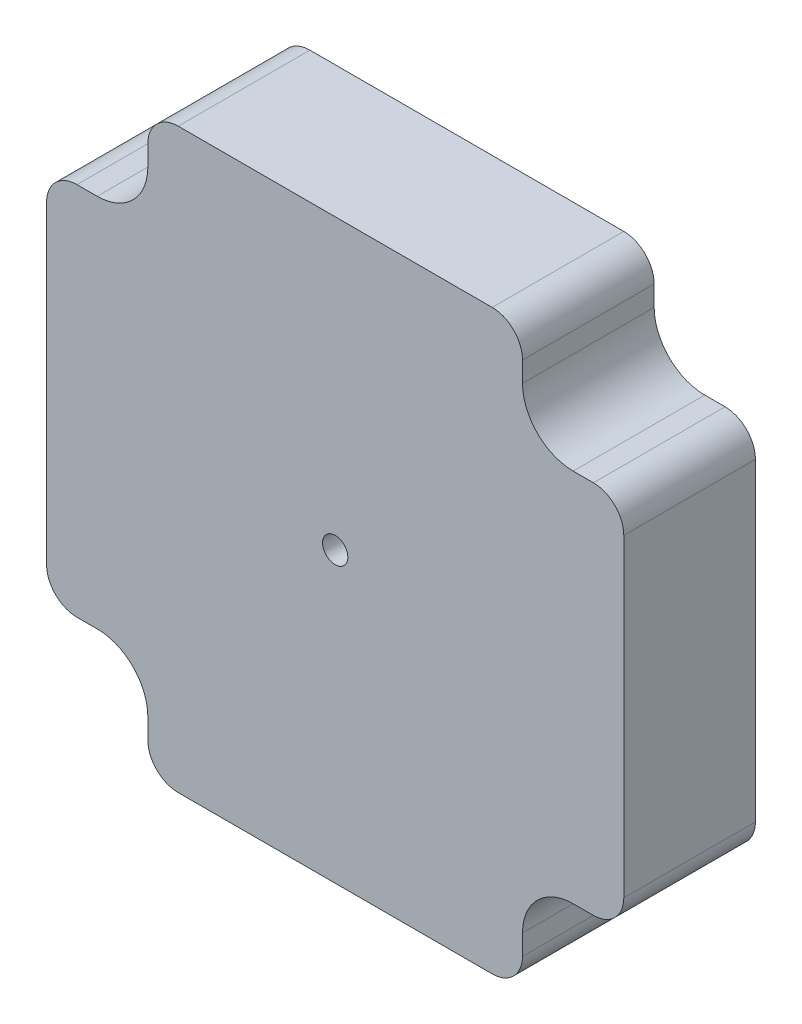
ISO-10303-21;
HEADER;
FILE_DESCRIPTION(('STEP AP214'),'2;1');
FILE_NAME('part.step','',(''),(''),'','','');
FILE_SCHEMA(('AUTOMOTIVE_DESIGN { 1 0 10303 214 1 1 1 1 }'));
ENDSEC;
DATA;
#1=APPLICATION_CONTEXT('core data for automotive mechanical design processes');
#2=APPLICATION_PROTOCOL_DEFINITION('international standard','automotive_design',2000,#1);
#3=PRODUCT_CONTEXT('',#1,'mechanical');
#4=PRODUCT('Part','Part','',(#3));
#5=PRODUCT_RELATED_PRODUCT_CATEGORY('part','',(#4));
#6=PRODUCT_DEFINITION_FORMATION('','',#4);
#7=PRODUCT_DEFINITION_CONTEXT('part definition',#1,'design');
#8=PRODUCT_DEFINITION('design','',#6,#7);
#9=PRODUCT_DEFINITION_SHAPE('','',#8);
#10=(LENGTH_UNIT() NAMED_UNIT(*) SI_UNIT(.MILLI.,.METRE.));
#11=(NAMED_UNIT(*) PLANE_ANGLE_UNIT() SI_UNIT($,.RADIAN.));
#12=(NAMED_UNIT(*) SI_UNIT($,.STERADIAN.) SOLID_ANGLE_UNIT());
#13=UNCERTAINTY_MEASURE_WITH_UNIT(LENGTH_MEASURE(1.E-05),#10,'distance_accuracy_value','');
#14=(GEOMETRIC_REPRESENTATION_CONTEXT(3) GLOBAL_UNCERTAINTY_ASSIGNED_CONTEXT((#13)) GLOBAL_UNIT_ASSIGNED_CONTEXT((#10,
#11,#12)) REPRESENTATION_CONTEXT('',''));
#15=CARTESIAN_POINT('',(0.,0.,0.));
#16=DIRECTION('',(0.,0.,1.));
#17=DIRECTION('',(1.,0.,0.));
#18=AXIS2_PLACEMENT_3D('',#15,#16,#17);
#19=CARTESIAN_POINT('',(-15.348869153361,-1.196280991736,-59.4999875));
#20=DIRECTION('',(0.,0.,-1.));
#21=DIRECTION('',(0.,1.,0.));
#22=AXIS2_PLACEMENT_3D('',#19,#20,#21);
#23=PLANE('',#22);
#24=CARTESIAN_POINT('',(8.151130846639,22.303719008264,-59.4999875));
#25=DIRECTION('',(0.,0.,1.));
#26=DIRECTION('',(0.,-1.,0.));
#27=AXIS2_PLACEMENT_3D('',#24,#25,#26);
#28=CIRCLE('',#27,1.25);
#29=CARTESIAN_POINT('',(8.151130846639,21.053719008264,-59.4999875));
#30=VERTEX_POINT('',#29);
#31=EDGE_CURVE('E359',#30,#30,#28,.T.);
#32=ORIENTED_EDGE('',*,*,#31,.T.);
#33=EDGE_LOOP('',(#32));
#34=FACE_BOUND('',#33,.T.);
#35=CARTESIAN_POINT('',(-7.348869153361,-3.196280991736,-59.4999875));
#36=DIRECTION('',(0.,0.,1.));
#37=DIRECTION('',(0.,1.,0.));
#38=AXIS2_PLACEMENT_3D('',#35,#36,#37);
#39=CIRCLE('',#38,3.);
#40=CARTESIAN_POINT('',(-10.348869153361,-3.196280991736,-59.4999875));
#41=VERTEX_POINT('',#40);
#42=CARTESIAN_POINT('',(-7.348869153361,-6.196280991736,-59.4999875));
#43=VERTEX_POINT('',#42);
#44=EDGE_CURVE('E318',#41,#43,#39,.T.);
#45=ORIENTED_EDGE('',*,*,#44,.F.);
#46=DIRECTION('',(0.,1.,0.));
#47=VECTOR('',#46,1.);
#48=CARTESIAN_POINT('',(-10.348869153361,-1.196280991736,-59.4999875));
#49=LINE('',#48,#47);
#50=CARTESIAN_POINT('',(-10.348869153361,-1.196280991736,-59.4999875));
#51=VERTEX_POINT('',#50);
#52=EDGE_CURVE('E315',#41,#51,#49,.T.);
#53=ORIENTED_EDGE('',*,*,#52,.T.);
#54=CARTESIAN_POINT('',(-15.348869153361,-1.196280991736,-59.4999875));
#55=DIRECTION('',(0.,0.,1.));
#56=DIRECTION('',(0.,1.,0.));
#57=AXIS2_PLACEMENT_3D('',#54,#55,#56);
#58=CIRCLE('',#57,5.);
#59=CARTESIAN_POINT('',(-15.348869153361,3.803719008264,-59.4999875));
#60=VERTEX_POINT('',#59);
#61=EDGE_CURVE('E459',#51,#60,#58,.T.);
#62=ORIENTED_EDGE('',*,*,#61,.T.);
#63=DIRECTION('',(-1.,0.,0.));
#64=VECTOR('',#63,1.);
#65=CARTESIAN_POINT('',(-17.348869153361,3.803719008264,-59.4999875));
#66=LINE('',#65,#64);
#67=CARTESIAN_POINT('',(-17.348869153361,3.803719008264,-59.4999875));
#68=VERTEX_POINT('',#67);
#69=EDGE_CURVE('E11',#60,#68,#66,.T.);
#70=ORIENTED_EDGE('',*,*,#69,.T.);
#71=CARTESIAN_POINT('',(-17.348869153361,6.803719008264,-59.4999875));
#72=DIRECTION('',(0.,0.,1.));
#73=DIRECTION('',(0.,1.,0.));
#74=AXIS2_PLACEMENT_3D('',#71,#72,#73);
#75=CIRCLE('',#74,3.);
#76=CARTESIAN_POINT('',(-20.348869153361,6.803719008264,-59.4999875));
#77=VERTEX_POINT('',#76);
#78=EDGE_CURVE('E339',#77,#68,#75,.T.);
#79=ORIENTED_EDGE('',*,*,#78,.F.);
#80=DIRECTION('',(0.,1.,0.));
#81=VECTOR('',#80,1.);
#82=CARTESIAN_POINT('',(-20.348869153361,37.803719008264,-59.4999875));
#83=LINE('',#82,#81);
#84=CARTESIAN_POINT('',(-20.348869153361,37.803719008264,-59.4999875));
#85=VERTEX_POINT('',#84);
#86=EDGE_CURVE('E340',#77,#85,#83,.T.);
#87=ORIENTED_EDGE('',*,*,#86,.T.);
#88=CARTESIAN_POINT('',(-17.348869153361,37.803719008264,-59.4999875));
#89=DIRECTION('',(0.,0.,1.));
#90=DIRECTION('',(0.,1.,0.));
#91=AXIS2_PLACEMENT_3D('',#88,#89,#90);
#92=CIRCLE('',#91,3.);
#93=CARTESIAN_POINT('',(-17.348869153361,40.803719008264,-59.4999875));
#94=VERTEX_POINT('',#93);
#95=EDGE_CURVE('E353',#94,#85,#92,.T.);
#96=ORIENTED_EDGE('',*,*,#95,.F.);
#97=DIRECTION('',(1.,0.,0.));
#98=VECTOR('',#97,1.);
#99=CARTESIAN_POINT('',(-15.348869153361,40.803719008264,-59.4999875));
#100=LINE('',#99,#98);
#101=CARTESIAN_POINT('',(-15.348869153361,40.803719008264,-59.4999875));
#102=VERTEX_POINT('',#101);
#103=EDGE_CURVE('E358',#94,#102,#100,.T.);
#104=ORIENTED_EDGE('',*,*,#103,.T.);
#105=CARTESIAN_POINT('',(-15.348869153361,45.803719008264,-59.4999875));
#106=DIRECTION('',(0.,0.,1.));
#107=DIRECTION('',(0.,1.,0.));
#108=AXIS2_PLACEMENT_3D('',#105,#106,#107);
#109=CIRCLE('',#108,5.);
#110=CARTESIAN_POINT('',(-10.348869153361,45.803719008264,-59.4999875));
#111=VERTEX_POINT('',#110);
#112=EDGE_CURVE('E400',#102,#111,#109,.T.);
#113=ORIENTED_EDGE('',*,*,#112,.T.);
#114=DIRECTION('',(0.,1.,0.));
#115=VECTOR('',#114,1.);
#116=CARTESIAN_POINT('',(-10.348869153361,47.803719008264,-59.4999875));
#117=LINE('',#116,#115);
#118=CARTESIAN_POINT('',(-10.348869153361,47.803719008264,-59.4999875));
#119=VERTEX_POINT('',#118);
#120=EDGE_CURVE('E371',#111,#119,#117,.T.);
#121=ORIENTED_EDGE('',*,*,#120,.T.);
#122=CARTESIAN_POINT('',(-7.348869153361,47.803719008264,-59.4999875));
#123=DIRECTION('',(0.,0.,1.));
#124=DIRECTION('',(0.,1.,0.));
#125=AXIS2_PLACEMENT_3D('',#122,#123,#124);
#126=CIRCLE('',#125,3.);
#127=CARTESIAN_POINT('',(-7.348869153361,50.803719008264,-59.4999875));
#128=VERTEX_POINT('',#127);
#129=EDGE_CURVE('E313',#128,#119,#126,.T.);
#130=ORIENTED_EDGE('',*,*,#129,.F.);
#131=DIRECTION('',(1.,0.,0.));
#132=VECTOR('',#131,1.);
#133=CARTESIAN_POINT('',(23.651130846639,50.803719008264,-59.4999875));
#134=LINE('',#133,#132);
#135=CARTESIAN_POINT('',(23.651130846639,50.803719008264,-59.4999875));
#136=VERTEX_POINT('',#135);
#137=EDGE_CURVE('E326',#128,#136,#134,.T.);
#138=ORIENTED_EDGE('',*,*,#137,.T.);
#139=CARTESIAN_POINT('',(23.651130846639,47.803719008264,-59.4999875));
#140=DIRECTION('',(0.,0.,1.));
#141=DIRECTION('',(0.,1.,0.));
#142=AXIS2_PLACEMENT_3D('',#139,#140,#141);
#143=CIRCLE('',#142,3.);
#144=CARTESIAN_POINT('',(26.651130846639,47.803719008264,-59.4999875));
#145=VERTEX_POINT('',#144);
#146=EDGE_CURVE('E305',#145,#136,#143,.T.);
#147=ORIENTED_EDGE('',*,*,#146,.F.);
#148=DIRECTION('',(0.,-1.,0.));
#149=VECTOR('',#148,1.);
#150=CARTESIAN_POINT('',(26.651130846639,45.803719008264,-59.4999875));
#151=LINE('',#150,#149);
#152=CARTESIAN_POINT('',(26.651130846639,45.803719008264,-59.4999875));
#153=VERTEX_POINT('',#152);
#154=EDGE_CURVE('E263',#145,#153,#151,.T.);
#155=ORIENTED_EDGE('',*,*,#154,.T.);
#156=CARTESIAN_POINT('',(31.651130846639,45.803719008264,-59.4999875));
#157=DIRECTION('',(0.,0.,1.));
#158=DIRECTION('',(0.,1.,0.));
#159=AXIS2_PLACEMENT_3D('',#156,#157,#158);
#160=CIRCLE('',#159,5.);
#161=CARTESIAN_POINT('',(31.651130846639,40.803719008264,-59.4999875));
#162=VERTEX_POINT('',#161);
#163=EDGE_CURVE('E268',#153,#162,#160,.T.);
#164=ORIENTED_EDGE('',*,*,#163,.T.);
#165=DIRECTION('',(1.,0.,0.));
#166=VECTOR('',#165,1.);
#167=CARTESIAN_POINT('',(33.651130846639,40.803719008264,-59.4999875));
#168=LINE('',#167,#166);
#169=CARTESIAN_POINT('',(33.651130846639,40.803719008264,-59.4999875));
#170=VERTEX_POINT('',#169);
#171=EDGE_CURVE('E269',#162,#170,#168,.T.);
#172=ORIENTED_EDGE('',*,*,#171,.T.);
#173=CARTESIAN_POINT('',(33.651130846639,37.803719008264,-59.4999875));
#174=DIRECTION('',(0.,0.,1.));
#175=DIRECTION('',(0.,1.,0.));
#176=AXIS2_PLACEMENT_3D('',#173,#174,#175);
#177=CIRCLE('',#176,3.);
#178=CARTESIAN_POINT('',(36.651130846639,37.803719008264,-59.4999875));
#179=VERTEX_POINT('',#178);
#180=EDGE_CURVE('E289',#179,#170,#177,.T.);
#181=ORIENTED_EDGE('',*,*,#180,.F.);
#182=DIRECTION('',(0.,-1.,0.));
#183=VECTOR('',#182,1.);
#184=CARTESIAN_POINT('',(36.651130846639,6.803719008264,-59.4999875));
#185=LINE('',#184,#183);
#186=CARTESIAN_POINT('',(36.651130846639,6.803719008264,-59.4999875));
#187=VERTEX_POINT('',#186);
#188=EDGE_CURVE('E349',#179,#187,#185,.T.);
#189=ORIENTED_EDGE('',*,*,#188,.T.);
#190=CARTESIAN_POINT('',(33.651130846639,6.803719008264,-59.4999875));
#191=DIRECTION('',(0.,0.,1.));
#192=DIRECTION('',(0.,1.,0.));
#193=AXIS2_PLACEMENT_3D('',#190,#191,#192);
#194=CIRCLE('',#193,3.);
#195=CARTESIAN_POINT('',(33.651130846639,3.803719008264,-59.4999875));
#196=VERTEX_POINT('',#195);
#197=EDGE_CURVE('E384',#196,#187,#194,.T.);
#198=ORIENTED_EDGE('',*,*,#197,.F.);
#199=DIRECTION('',(-1.,0.,0.));
#200=VECTOR('',#199,1.);
#201=CARTESIAN_POINT('',(31.651130846639,3.803719008264,-59.4999875));
#202=LINE('',#201,#200);
#203=CARTESIAN_POINT('',(31.651130846639,3.803719008264,-59.4999875));
#204=VERTEX_POINT('',#203);
#205=EDGE_CURVE('E292',#196,#204,#202,.T.);
#206=ORIENTED_EDGE('',*,*,#205,.T.);
#207=CARTESIAN_POINT('',(31.651130846639,-1.196280991736,-59.4999875));
#208=DIRECTION('',(0.,0.,1.));
#209=DIRECTION('',(0.,1.,0.));
#210=AXIS2_PLACEMENT_3D('',#207,#208,#209);
#211=CIRCLE('',#210,5.);
#212=CARTESIAN_POINT('',(26.651130846639,-1.196280991736,-59.4999875));
#213=VERTEX_POINT('',#212);
#214=EDGE_CURVE('E380',#204,#213,#211,.T.);
#215=ORIENTED_EDGE('',*,*,#214,.T.);
#216=DIRECTION('',(0.,-1.,0.));
#217=VECTOR('',#216,1.);
#218=CARTESIAN_POINT('',(26.651130846639,-3.196280991736,-59.4999875));
#219=LINE('',#218,#217);
#220=CARTESIAN_POINT('',(26.651130846639,-3.196280991736,-59.4999875));
#221=VERTEX_POINT('',#220);
#222=EDGE_CURVE('E306',#213,#221,#219,.T.);
#223=ORIENTED_EDGE('',*,*,#222,.T.);
#224=CARTESIAN_POINT('',(23.651130846639,-3.196280991736,-59.4999875));
#225=DIRECTION('',(0.,0.,1.));
#226=DIRECTION('',(0.,1.,0.));
#227=AXIS2_PLACEMENT_3D('',#224,#225,#226);
#228=CIRCLE('',#227,3.);
#229=CARTESIAN_POINT('',(23.651130846639,-6.196280991736,-59.4999875));
#230=VERTEX_POINT('',#229);
#231=EDGE_CURVE('E295',#230,#221,#228,.T.);
#232=ORIENTED_EDGE('',*,*,#231,.F.);
#233=DIRECTION('',(-1.,0.,0.));
#234=VECTOR('',#233,1.);
#235=CARTESIAN_POINT('',(-7.348869153361,-6.196280991736,-59.4999875));
#236=LINE('',#235,#234);
#237=EDGE_CURVE('E300',#230,#43,#236,.T.);
#238=ORIENTED_EDGE('',*,*,#237,.T.);
#239=EDGE_LOOP('',(#45,#53,#62,#70,#79,#87,#96,#104,#113,#121,#130,#138,#147,#155,#164,#172,
#181,#189,#198,#206,#215,#223,#232,#238));
#240=FACE_BOUND('',#239,.T.);
#241=ADVANCED_FACE('F16',(#34,#240),#23,.T.);
#242=CARTESIAN_POINT('',(-17.348869153361,3.803719008264,-46.4999875));
#243=DIRECTION('',(0.,1.,0.));
#244=DIRECTION('',(0.,0.,-1.));
#245=AXIS2_PLACEMENT_3D('',#242,#243,#244);
#246=PLANE('',#245);
#247=DIRECTION('',(0.,0.,1.));
#248=VECTOR('',#247,1.);
#249=CARTESIAN_POINT('',(-15.348869153361,3.803719008264,-46.4999875));
#250=LINE('',#249,#248);
#251=CARTESIAN_POINT('',(-15.348869153361,3.803719008264,-46.4999875));
#252=VERTEX_POINT('',#251);
#253=EDGE_CURVE('E468',#60,#252,#250,.T.);
#254=ORIENTED_EDGE('',*,*,#253,.T.);
#255=DIRECTION('',(-1.,0.,0.));
#256=VECTOR('',#255,1.);
#257=CARTESIAN_POINT('',(-15.348869153361,3.803719008264,-46.4999875));
#258=LINE('',#257,#256);
#259=CARTESIAN_POINT('',(-17.348869153361,3.803719008264,-46.4999875));
#260=VERTEX_POINT('',#259);
#261=EDGE_CURVE('E369',#252,#260,#258,.T.);
#262=ORIENTED_EDGE('',*,*,#261,.T.);
#263=DIRECTION('',(0.,0.,1.));
#264=VECTOR('',#263,1.);
#265=CARTESIAN_POINT('',(-17.348869153361,3.803719008264,-46.4999875));
#266=LINE('',#265,#264);
#267=EDGE_CURVE('E27',#68,#260,#266,.T.);
#268=ORIENTED_EDGE('',*,*,#267,.F.);
#269=ORIENTED_EDGE('',*,*,#69,.F.);
#270=EDGE_LOOP('',(#254,#262,#268,#269));
#271=FACE_BOUND('',#270,.T.);
#272=ADVANCED_FACE('F575',(#271),#246,.F.);
#273=CARTESIAN_POINT('',(-17.348869153361,6.803719008264,-46.4999875));
#274=DIRECTION('',(0.,0.,-1.));
#275=DIRECTION('',(0.,1.,0.));
#276=AXIS2_PLACEMENT_3D('',#273,#274,#275);
#277=CYLINDRICAL_SURFACE('',#276,3.);
#278=CARTESIAN_POINT('',(-17.348869153361,6.803719008264,-46.4999875));
#279=DIRECTION('',(0.,0.,-1.));
#280=DIRECTION('',(0.,1.,0.));
#281=AXIS2_PLACEMENT_3D('',#278,#279,#280);
#282=CIRCLE('',#281,3.);
#283=CARTESIAN_POINT('',(-20.348869153361,6.803719008264,-46.4999875));
#284=VERTEX_POINT('',#283);
#285=EDGE_CURVE('E365',#260,#284,#282,.T.);
#286=ORIENTED_EDGE('',*,*,#285,.T.);
#287=DIRECTION('',(0.,0.,-1.));
#288=VECTOR('',#287,1.);
#289=CARTESIAN_POINT('',(-20.348869153361,6.803719008264,-46.4999875));
#290=LINE('',#289,#288);
#291=EDGE_CURVE('E343',#284,#77,#290,.T.);
#292=ORIENTED_EDGE('',*,*,#291,.T.);
#293=ORIENTED_EDGE('',*,*,#78,.T.);
#294=ORIENTED_EDGE('',*,*,#267,.T.);
#295=EDGE_LOOP('',(#286,#292,#293,#294));
#296=FACE_BOUND('',#295,.T.);
#297=ADVANCED_FACE('F570',(#296),#277,.T.);
#298=CARTESIAN_POINT('',(-20.348869153361,37.803719008264,-46.4999875));
#299=DIRECTION('',(1.,0.,0.));
#300=DIRECTION('',(0.,1.,0.));
#301=AXIS2_PLACEMENT_3D('',#298,#299,#300);
#302=PLANE('',#301);
#303=ORIENTED_EDGE('',*,*,#291,.F.);
#304=DIRECTION('',(0.,1.,0.));
#305=VECTOR('',#304,1.);
#306=CARTESIAN_POINT('',(-20.348869153361,-1.196280991736,-46.4999875));
#307=LINE('',#306,#305);
#308=CARTESIAN_POINT('',(-20.348869153361,37.803719008264,-46.4999875));
#309=VERTEX_POINT('',#308);
#310=EDGE_CURVE('E370',#284,#309,#307,.T.);
#311=ORIENTED_EDGE('',*,*,#310,.T.);
#312=DIRECTION('',(0.,0.,1.));
#313=VECTOR('',#312,1.);
#314=CARTESIAN_POINT('',(-20.348869153361,37.803719008264,-46.4999875));
#315=LINE('',#314,#313);
#316=EDGE_CURVE('E357',#85,#309,#315,.T.);
#317=ORIENTED_EDGE('',*,*,#316,.F.);
#318=ORIENTED_EDGE('',*,*,#86,.F.);
#319=EDGE_LOOP('',(#303,#311,#317,#318));
#320=FACE_BOUND('',#319,.T.);
#321=ADVANCED_FACE('F18',(#320),#302,.F.);
#322=CARTESIAN_POINT('',(-17.348869153361,37.803719008264,-46.4999875));
#323=DIRECTION('',(0.,0.,-1.));
#324=DIRECTION('',(0.,1.,0.));
#325=AXIS2_PLACEMENT_3D('',#322,#323,#324);
#326=CYLINDRICAL_SURFACE('',#325,3.);
#327=CARTESIAN_POINT('',(-17.348869153361,37.803719008264,-46.4999875));
#328=DIRECTION('',(0.,0.,-1.));
#329=DIRECTION('',(0.,1.,0.));
#330=AXIS2_PLACEMENT_3D('',#327,#328,#329);
#331=CIRCLE('',#330,3.);
#332=CARTESIAN_POINT('',(-17.348869153361,40.803719008264,-46.4999875));
#333=VERTEX_POINT('',#332);
#334=EDGE_CURVE('E392',#309,#333,#331,.T.);
#335=ORIENTED_EDGE('',*,*,#334,.T.);
#336=DIRECTION('',(0.,0.,-1.));
#337=VECTOR('',#336,1.);
#338=CARTESIAN_POINT('',(-17.348869153361,40.803719008264,-46.4999875));
#339=LINE('',#338,#337);
#340=EDGE_CURVE('E427',#333,#94,#339,.T.);
#341=ORIENTED_EDGE('',*,*,#340,.T.);
#342=ORIENTED_EDGE('',*,*,#95,.T.);
#343=ORIENTED_EDGE('',*,*,#316,.T.);
#344=EDGE_LOOP('',(#335,#341,#342,#343));
#345=FACE_BOUND('',#344,.T.);
#346=ADVANCED_FACE('F604',(#345),#326,.T.);
#347=CARTESIAN_POINT('',(-15.348869153361,40.803719008264,-46.4999875));
#348=DIRECTION('',(0.,-1.,0.));
#349=DIRECTION('',(1.,0.,0.));
#350=AXIS2_PLACEMENT_3D('',#347,#348,#349);
#351=PLANE('',#350);
#352=ORIENTED_EDGE('',*,*,#340,.F.);
#353=DIRECTION('',(1.,0.,0.));
#354=VECTOR('',#353,1.);
#355=CARTESIAN_POINT('',(-15.348869153361,40.803719008264,-46.4999875));
#356=LINE('',#355,#354);
#357=CARTESIAN_POINT('',(-15.348869153361,40.803719008264,-46.4999875));
#358=VERTEX_POINT('',#357);
#359=EDGE_CURVE('E396',#333,#358,#356,.T.);
#360=ORIENTED_EDGE('',*,*,#359,.T.);
#361=DIRECTION('',(0.,0.,-1.));
#362=VECTOR('',#361,1.);
#363=CARTESIAN_POINT('',(-15.348869153361,40.803719008264,-46.4999875));
#364=LINE('',#363,#362);
#365=EDGE_CURVE('E375',#358,#102,#364,.T.);
#366=ORIENTED_EDGE('',*,*,#365,.T.);
#367=ORIENTED_EDGE('',*,*,#103,.F.);
#368=EDGE_LOOP('',(#352,#360,#366,#367));
#369=FACE_BOUND('',#368,.T.);
#370=ADVANCED_FACE('F591',(#369),#351,.F.);
#371=CARTESIAN_POINT('',(-15.348869153361,45.803719008264,-46.4999875));
#372=DIRECTION('',(0.,0.,-1.));
#373=DIRECTION('',(0.,1.,0.));
#374=AXIS2_PLACEMENT_3D('',#371,#372,#373);
#375=CYLINDRICAL_SURFACE('',#374,5.);
#376=ORIENTED_EDGE('',*,*,#365,.F.);
#377=CARTESIAN_POINT('',(-15.348869153361,45.803719008264,-46.4999875));
#378=DIRECTION('',(0.,0.,1.));
#379=DIRECTION('',(0.,1.,0.));
#380=AXIS2_PLACEMENT_3D('',#377,#378,#379);
#381=CIRCLE('',#380,5.);
#382=CARTESIAN_POINT('',(-10.348869153361,45.803719008264,-46.4999875));
#383=VERTEX_POINT('',#382);
#384=EDGE_CURVE('E20',#358,#383,#381,.T.);
#385=ORIENTED_EDGE('',*,*,#384,.T.);
#386=DIRECTION('',(0.,0.,-1.));
#387=VECTOR('',#386,1.);
#388=CARTESIAN_POINT('',(-10.348869153361,45.803719008264,-46.4999875));
#389=LINE('',#388,#387);
#390=EDGE_CURVE('E312',#383,#111,#389,.T.);
#391=ORIENTED_EDGE('',*,*,#390,.T.);
#392=ORIENTED_EDGE('',*,*,#112,.F.);
#393=EDGE_LOOP('',(#376,#385,#391,#392));
#394=FACE_BOUND('',#393,.T.);
#395=ADVANCED_FACE('F585',(#394),#375,.F.);
#396=CARTESIAN_POINT('',(-10.348869153361,47.803719008264,-46.4999875));
#397=DIRECTION('',(1.,0.,0.));
#398=DIRECTION('',(0.,0.,1.));
#399=AXIS2_PLACEMENT_3D('',#396,#397,#398);
#400=PLANE('',#399);
#401=ORIENTED_EDGE('',*,*,#390,.F.);
#402=DIRECTION('',(0.,1.,0.));
#403=VECTOR('',#402,1.);
#404=CARTESIAN_POINT('',(-10.348869153361,-1.196280991736,-46.4999875));
#405=LINE('',#404,#403);
#406=CARTESIAN_POINT('',(-10.348869153361,47.803719008264,-46.4999875));
#407=VERTEX_POINT('',#406);
#408=EDGE_CURVE('E344',#383,#407,#405,.T.);
#409=ORIENTED_EDGE('',*,*,#408,.T.);
#410=DIRECTION('',(0.,0.,1.));
#411=VECTOR('',#410,1.);
#412=CARTESIAN_POINT('',(-10.348869153361,47.803719008264,-46.4999875));
#413=LINE('',#412,#411);
#414=EDGE_CURVE('E310',#119,#407,#413,.T.);
#415=ORIENTED_EDGE('',*,*,#414,.F.);
#416=ORIENTED_EDGE('',*,*,#120,.F.);
#417=EDGE_LOOP('',(#401,#409,#415,#416));
#418=FACE_BOUND('',#417,.T.);
#419=ADVANCED_FACE('F590',(#418),#400,.F.);
#420=CARTESIAN_POINT('',(-7.348869153361,47.803719008264,-46.4999875));
#421=DIRECTION('',(0.,0.,-1.));
#422=DIRECTION('',(0.,1.,0.));
#423=AXIS2_PLACEMENT_3D('',#420,#421,#422);
#424=CYLINDRICAL_SURFACE('',#423,3.);
#425=CARTESIAN_POINT('',(-7.348869153361,47.803719008264,-46.4999875));
#426=DIRECTION('',(0.,0.,-1.));
#427=DIRECTION('',(0.,1.,0.));
#428=AXIS2_PLACEMENT_3D('',#425,#426,#427);
#429=CIRCLE('',#428,3.);
#430=CARTESIAN_POINT('',(-7.348869153361,50.803719008264,-46.4999875));
#431=VERTEX_POINT('',#430);
#432=EDGE_CURVE('E348',#407,#431,#429,.T.);
#433=ORIENTED_EDGE('',*,*,#432,.T.);
#434=DIRECTION('',(0.,0.,-1.));
#435=VECTOR('',#434,1.);
#436=CARTESIAN_POINT('',(-7.348869153361,50.803719008264,-46.4999875));
#437=LINE('',#436,#435);
#438=EDGE_CURVE('E304',#431,#128,#437,.T.);
#439=ORIENTED_EDGE('',*,*,#438,.T.);
#440=ORIENTED_EDGE('',*,*,#129,.T.);
#441=ORIENTED_EDGE('',*,*,#414,.T.);
#442=EDGE_LOOP('',(#433,#439,#440,#441));
#443=FACE_BOUND('',#442,.T.);
#444=ADVANCED_FACE('F530',(#443),#424,.T.);
#445=CARTESIAN_POINT('',(23.651130846639,50.803719008264,-46.4999875));
#446=DIRECTION('',(0.,-1.,0.));
#447=DIRECTION('',(1.,0.,0.));
#448=AXIS2_PLACEMENT_3D('',#445,#446,#447);
#449=PLANE('',#448);
#450=ORIENTED_EDGE('',*,*,#438,.F.);
#451=DIRECTION('',(1.,0.,0.));
#452=VECTOR('',#451,1.);
#453=CARTESIAN_POINT('',(-15.348869153361,50.803719008264,-46.4999875));
#454=LINE('',#453,#452);
#455=CARTESIAN_POINT('',(23.651130846639,50.803719008264,-46.4999875));
#456=VERTEX_POINT('',#455);
#457=EDGE_CURVE('E455',#431,#456,#454,.T.);
#458=ORIENTED_EDGE('',*,*,#457,.T.);
#459=DIRECTION('',(0.,0.,1.));
#460=VECTOR('',#459,1.);
#461=CARTESIAN_POINT('',(23.651130846639,50.803719008264,-46.4999875));
#462=LINE('',#461,#460);
#463=EDGE_CURVE('E301',#136,#456,#462,.T.);
#464=ORIENTED_EDGE('',*,*,#463,.F.);
#465=ORIENTED_EDGE('',*,*,#137,.F.);
#466=EDGE_LOOP('',(#450,#458,#464,#465));
#467=FACE_BOUND('',#466,.T.);
#468=ADVANCED_FACE('F524',(#467),#449,.F.);
#469=CARTESIAN_POINT('',(23.651130846639,47.803719008264,-46.4999875));
#470=DIRECTION('',(0.,0.,-1.));
#471=DIRECTION('',(0.,1.,0.));
#472=AXIS2_PLACEMENT_3D('',#469,#470,#471);
#473=CYLINDRICAL_SURFACE('',#472,3.);
#474=CARTESIAN_POINT('',(23.651130846639,47.803719008264,-46.4999875));
#475=DIRECTION('',(0.,0.,-1.));
#476=DIRECTION('',(0.,1.,0.));
#477=AXIS2_PLACEMENT_3D('',#474,#475,#476);
#478=CIRCLE('',#477,3.);
#479=CARTESIAN_POINT('',(26.651130846639,47.803719008264,-46.4999875));
#480=VERTEX_POINT('',#479);
#481=EDGE_CURVE('E408',#456,#480,#478,.T.);
#482=ORIENTED_EDGE('',*,*,#481,.T.);
#483=DIRECTION('',(0.,0.,-1.));
#484=VECTOR('',#483,1.);
#485=CARTESIAN_POINT('',(26.651130846639,47.803719008264,-46.4999875));
#486=LINE('',#485,#484);
#487=EDGE_CURVE('E273',#480,#145,#486,.T.);
#488=ORIENTED_EDGE('',*,*,#487,.T.);
#489=ORIENTED_EDGE('',*,*,#146,.T.);
#490=ORIENTED_EDGE('',*,*,#463,.T.);
#491=EDGE_LOOP('',(#482,#488,#489,#490));
#492=FACE_BOUND('',#491,.T.);
#493=ADVANCED_FACE('F529',(#492),#473,.T.);
#494=CARTESIAN_POINT('',(26.651130846639,45.803719008264,-46.4999875));
#495=DIRECTION('',(-1.,0.,0.));
#496=DIRECTION('',(0.,-1.,0.));
#497=AXIS2_PLACEMENT_3D('',#494,#495,#496);
#498=PLANE('',#497);
#499=ORIENTED_EDGE('',*,*,#487,.F.);
#500=DIRECTION('',(0.,-1.,0.));
#501=VECTOR('',#500,1.);
#502=CARTESIAN_POINT('',(26.651130846639,-1.196280991736,-46.4999875));
#503=LINE('',#502,#501);
#504=CARTESIAN_POINT('',(26.651130846639,45.803719008264,-46.4999875));
#505=VERTEX_POINT('',#504);
#506=EDGE_CURVE('E404',#480,#505,#503,.T.);
#507=ORIENTED_EDGE('',*,*,#506,.T.);
#508=DIRECTION('',(0.,0.,-1.));
#509=VECTOR('',#508,1.);
#510=CARTESIAN_POINT('',(26.651130846639,45.803719008264,-46.4999875));
#511=LINE('',#510,#509);
#512=EDGE_CURVE('E274',#505,#153,#511,.T.);
#513=ORIENTED_EDGE('',*,*,#512,.T.);
#514=ORIENTED_EDGE('',*,*,#154,.F.);
#515=EDGE_LOOP('',(#499,#507,#513,#514));
#516=FACE_BOUND('',#515,.T.);
#517=ADVANCED_FACE('F616',(#516),#498,.F.);
#518=CARTESIAN_POINT('',(31.651130846639,45.803719008264,-46.4999875));
#519=DIRECTION('',(0.,0.,-1.));
#520=DIRECTION('',(0.,1.,0.));
#521=AXIS2_PLACEMENT_3D('',#518,#519,#520);
#522=CYLINDRICAL_SURFACE('',#521,5.);
#523=ORIENTED_EDGE('',*,*,#512,.F.);
#524=CARTESIAN_POINT('',(31.651130846639,45.803719008264,-46.4999875));
#525=DIRECTION('',(0.,0.,1.));
#526=DIRECTION('',(0.,1.,0.));
#527=AXIS2_PLACEMENT_3D('',#524,#525,#526);
#528=CIRCLE('',#527,5.);
#529=CARTESIAN_POINT('',(31.651130846639,40.803719008264,-46.4999875));
#530=VERTEX_POINT('',#529);
#531=EDGE_CURVE('E281',#505,#530,#528,.T.);
#532=ORIENTED_EDGE('',*,*,#531,.T.);
#533=DIRECTION('',(0.,0.,-1.));
#534=VECTOR('',#533,1.);
#535=CARTESIAN_POINT('',(31.651130846639,40.803719008264,-46.4999875));
#536=LINE('',#535,#534);
#537=EDGE_CURVE('E223',#530,#162,#536,.T.);
#538=ORIENTED_EDGE('',*,*,#537,.T.);
#539=ORIENTED_EDGE('',*,*,#163,.F.);
#540=EDGE_LOOP('',(#523,#532,#538,#539));
#541=FACE_BOUND('',#540,.T.);
#542=ADVANCED_FACE('F279',(#541),#522,.F.);
#543=CARTESIAN_POINT('',(33.651130846639,40.803719008264,-46.4999875));
#544=DIRECTION('',(0.,-1.,0.));
#545=DIRECTION('',(1.,0.,0.));
#546=AXIS2_PLACEMENT_3D('',#543,#544,#545);
#547=PLANE('',#546);
#548=ORIENTED_EDGE('',*,*,#537,.F.);
#549=DIRECTION('',(1.,0.,0.));
#550=VECTOR('',#549,1.);
#551=CARTESIAN_POINT('',(-15.348869153361,40.803719008264,-46.4999875));
#552=LINE('',#551,#550);
#553=CARTESIAN_POINT('',(33.651130846639,40.803719008264,-46.4999875));
#554=VERTEX_POINT('',#553);
#555=EDGE_CURVE('E390',#530,#554,#552,.T.);
#556=ORIENTED_EDGE('',*,*,#555,.T.);
#557=DIRECTION('',(0.,0.,1.));
#558=VECTOR('',#557,1.);
#559=CARTESIAN_POINT('',(33.651130846639,40.803719008264,-46.4999875));
#560=LINE('',#559,#558);
#561=EDGE_CURVE('E211',#170,#554,#560,.T.);
#562=ORIENTED_EDGE('',*,*,#561,.F.);
#563=ORIENTED_EDGE('',*,*,#171,.F.);
#564=EDGE_LOOP('',(#548,#556,#562,#563));
#565=FACE_BOUND('',#564,.T.);
#566=ADVANCED_FACE('F276',(#565),#547,.F.);
#567=CARTESIAN_POINT('',(33.651130846639,37.803719008264,-46.4999875));
#568=DIRECTION('',(0.,0.,-1.));
#569=DIRECTION('',(0.,1.,0.));
#570=AXIS2_PLACEMENT_3D('',#567,#568,#569);
#571=CYLINDRICAL_SURFACE('',#570,3.);
#572=CARTESIAN_POINT('',(33.651130846639,37.803719008264,-46.4999875));
#573=DIRECTION('',(0.,0.,-1.));
#574=DIRECTION('',(0.,1.,0.));
#575=AXIS2_PLACEMENT_3D('',#572,#573,#574);
#576=CIRCLE('',#575,3.);
#577=CARTESIAN_POINT('',(36.651130846639,37.803719008264,-46.4999875));
#578=VERTEX_POINT('',#577);
#579=EDGE_CURVE('E387',#554,#578,#576,.T.);
#580=ORIENTED_EDGE('',*,*,#579,.T.);
#581=DIRECTION('',(0.,0.,-1.));
#582=VECTOR('',#581,1.);
#583=CARTESIAN_POINT('',(36.651130846639,37.803719008264,-46.4999875));
#584=LINE('',#583,#582);
#585=EDGE_CURVE('E352',#578,#179,#584,.T.);
#586=ORIENTED_EDGE('',*,*,#585,.T.);
#587=ORIENTED_EDGE('',*,*,#180,.T.);
#588=ORIENTED_EDGE('',*,*,#561,.T.);
#589=EDGE_LOOP('',(#580,#586,#587,#588));
#590=FACE_BOUND('',#589,.T.);
#591=ADVANCED_FACE('F561',(#590),#571,.T.);
#592=CARTESIAN_POINT('',(36.651130846639,6.803719008264,-46.4999875));
#593=DIRECTION('',(-1.,0.,0.));
#594=DIRECTION('',(0.,0.,1.));
#595=AXIS2_PLACEMENT_3D('',#592,#593,#594);
#596=PLANE('',#595);
#597=ORIENTED_EDGE('',*,*,#585,.F.);
#598=DIRECTION('',(0.,-1.,0.));
#599=VECTOR('',#598,1.);
#600=CARTESIAN_POINT('',(36.651130846639,-1.196280991736,-46.4999875));
#601=LINE('',#600,#599);
#602=CARTESIAN_POINT('',(36.651130846639,6.803719008264,-46.4999875));
#603=VERTEX_POINT('',#602);
#604=EDGE_CURVE('E391',#578,#603,#601,.T.);
#605=ORIENTED_EDGE('',*,*,#604,.T.);
#606=DIRECTION('',(0.,0.,1.));
#607=VECTOR('',#606,1.);
#608=CARTESIAN_POINT('',(36.651130846639,6.803719008264,-46.4999875));
#609=LINE('',#608,#607);
#610=EDGE_CURVE('E381',#187,#603,#609,.T.);
#611=ORIENTED_EDGE('',*,*,#610,.F.);
#612=ORIENTED_EDGE('',*,*,#188,.F.);
#613=EDGE_LOOP('',(#597,#605,#611,#612));
#614=FACE_BOUND('',#613,.T.);
#615=ADVANCED_FACE('F635',(#614),#596,.F.);
#616=CARTESIAN_POINT('',(33.651130846639,6.803719008264,-46.4999875));
#617=DIRECTION('',(0.,0.,-1.));
#618=DIRECTION('',(0.,1.,0.));
#619=AXIS2_PLACEMENT_3D('',#616,#617,#618);
#620=CYLINDRICAL_SURFACE('',#619,3.);
#621=CARTESIAN_POINT('',(33.651130846639,6.803719008264,-46.4999875));
#622=DIRECTION('',(0.,0.,-1.));
#623=DIRECTION('',(0.,1.,0.));
#624=AXIS2_PLACEMENT_3D('',#621,#622,#623);
#625=CIRCLE('',#624,3.);
#626=CARTESIAN_POINT('',(33.651130846639,3.803719008264,-46.4999875));
#627=VERTEX_POINT('',#626);
#628=EDGE_CURVE('E424',#603,#627,#625,.T.);
#629=ORIENTED_EDGE('',*,*,#628,.T.);
#630=DIRECTION('',(0.,0.,-1.));
#631=VECTOR('',#630,1.);
#632=CARTESIAN_POINT('',(33.651130846639,3.803719008264,-46.4999875));
#633=LINE('',#632,#631);
#634=EDGE_CURVE('E99',#627,#196,#633,.T.);
#635=ORIENTED_EDGE('',*,*,#634,.T.);
#636=ORIENTED_EDGE('',*,*,#197,.T.);
#637=ORIENTED_EDGE('',*,*,#610,.T.);
#638=EDGE_LOOP('',(#629,#635,#636,#637));
#639=FACE_BOUND('',#638,.T.);
#640=ADVANCED_FACE('F640',(#639),#620,.T.);
#641=CARTESIAN_POINT('',(31.651130846639,3.803719008264,-46.4999875));
#642=DIRECTION('',(0.,1.,0.));
#643=DIRECTION('',(0.,0.,-1.));
#644=AXIS2_PLACEMENT_3D('',#641,#642,#643);
#645=PLANE('',#644);
#646=ORIENTED_EDGE('',*,*,#634,.F.);
#647=DIRECTION('',(-1.,0.,0.));
#648=VECTOR('',#647,1.);
#649=CARTESIAN_POINT('',(-15.348869153361,3.803719008264,-46.4999875));
#650=LINE('',#649,#648);
#651=CARTESIAN_POINT('',(31.651130846639,3.803719008264,-46.4999875));
#652=VERTEX_POINT('',#651);
#653=EDGE_CURVE('E444',#627,#652,#650,.T.);
#654=ORIENTED_EDGE('',*,*,#653,.T.);
#655=DIRECTION('',(0.,0.,-1.));
#656=VECTOR('',#655,1.);
#657=CARTESIAN_POINT('',(31.651130846639,3.803719008264,-46.4999875));
#658=LINE('',#657,#656);
#659=EDGE_CURVE('E114',#652,#204,#658,.T.);
#660=ORIENTED_EDGE('',*,*,#659,.T.);
#661=ORIENTED_EDGE('',*,*,#205,.F.);
#662=EDGE_LOOP('',(#646,#654,#660,#661));
#663=FACE_BOUND('',#662,.T.);
#664=ADVANCED_FACE('F699',(#663),#645,.F.);
#665=CARTESIAN_POINT('',(31.651130846639,-1.196280991736,-46.4999875));
#666=DIRECTION('',(0.,0.,-1.));
#667=DIRECTION('',(0.,1.,0.));
#668=AXIS2_PLACEMENT_3D('',#665,#666,#667);
#669=CYLINDRICAL_SURFACE('',#668,5.);
#670=ORIENTED_EDGE('',*,*,#659,.F.);
#671=CARTESIAN_POINT('',(31.651130846639,-1.196280991736,-46.4999875));
#672=DIRECTION('',(0.,0.,1.));
#673=DIRECTION('',(0.,1.,0.));
#674=AXIS2_PLACEMENT_3D('',#671,#672,#673);
#675=CIRCLE('',#674,5.);
#676=CARTESIAN_POINT('',(26.651130846639,-1.196280991736,-46.4999875));
#677=VERTEX_POINT('',#676);
#678=EDGE_CURVE('E443',#652,#677,#675,.T.);
#679=ORIENTED_EDGE('',*,*,#678,.T.);
#680=DIRECTION('',(0.,0.,-1.));
#681=VECTOR('',#680,1.);
#682=CARTESIAN_POINT('',(26.651130846639,-1.196280991736,-46.4999875));
#683=LINE('',#682,#681);
#684=EDGE_CURVE('E308',#677,#213,#683,.T.);
#685=ORIENTED_EDGE('',*,*,#684,.T.);
#686=ORIENTED_EDGE('',*,*,#214,.F.);
#687=EDGE_LOOP('',(#670,#679,#685,#686));
#688=FACE_BOUND('',#687,.T.);
#689=ADVANCED_FACE('F690',(#688),#669,.F.);
#690=CARTESIAN_POINT('',(26.651130846639,-3.196280991736,-46.4999875));
#691=DIRECTION('',(-1.,0.,0.));
#692=DIRECTION('',(0.,-1.,0.));
#693=AXIS2_PLACEMENT_3D('',#690,#691,#692);
#694=PLANE('',#693);
#695=ORIENTED_EDGE('',*,*,#684,.F.);
#696=DIRECTION('',(0.,-1.,0.));
#697=VECTOR('',#696,1.);
#698=CARTESIAN_POINT('',(26.651130846639,-1.196280991736,-46.4999875));
#699=LINE('',#698,#697);
#700=CARTESIAN_POINT('',(26.651130846639,-3.196280991736,-46.4999875));
#701=VERTEX_POINT('',#700);
#702=EDGE_CURVE('E420',#677,#701,#699,.T.);
#703=ORIENTED_EDGE('',*,*,#702,.T.);
#704=DIRECTION('',(0.,0.,1.));
#705=VECTOR('',#704,1.);
#706=CARTESIAN_POINT('',(26.651130846639,-3.196280991736,-46.4999875));
#707=LINE('',#706,#705);
#708=EDGE_CURVE('E299',#221,#701,#707,.T.);
#709=ORIENTED_EDGE('',*,*,#708,.F.);
#710=ORIENTED_EDGE('',*,*,#222,.F.);
#711=EDGE_LOOP('',(#695,#703,#709,#710));
#712=FACE_BOUND('',#711,.T.);
#713=ADVANCED_FACE('F662',(#712),#694,.F.);
#714=CARTESIAN_POINT('',(23.651130846639,-3.196280991736,-46.4999875));
#715=DIRECTION('',(0.,0.,-1.));
#716=DIRECTION('',(0.,1.,0.));
#717=AXIS2_PLACEMENT_3D('',#714,#715,#716);
#718=CYLINDRICAL_SURFACE('',#717,3.);
#719=CARTESIAN_POINT('',(23.651130846639,-3.196280991736,-46.4999875));
#720=DIRECTION('',(0.,0.,-1.));
#721=DIRECTION('',(0.,1.,0.));
#722=AXIS2_PLACEMENT_3D('',#719,#720,#721);
#723=CIRCLE('',#722,3.);
#724=CARTESIAN_POINT('',(23.651130846639,-6.196280991736,-46.4999875));
#725=VERTEX_POINT('',#724);
#726=EDGE_CURVE('E336',#701,#725,#723,.T.);
#727=ORIENTED_EDGE('',*,*,#726,.T.);
#728=DIRECTION('',(0.,0.,-1.));
#729=VECTOR('',#728,1.);
#730=CARTESIAN_POINT('',(23.651130846639,-6.196280991736,-46.4999875));
#731=LINE('',#730,#729);
#732=EDGE_CURVE('E471',#725,#230,#731,.T.);
#733=ORIENTED_EDGE('',*,*,#732,.T.);
#734=ORIENTED_EDGE('',*,*,#231,.T.);
#735=ORIENTED_EDGE('',*,*,#708,.T.);
#736=EDGE_LOOP('',(#727,#733,#734,#735));
#737=FACE_BOUND('',#736,.T.);
#738=ADVANCED_FACE('F547',(#737),#718,.T.);
#739=CARTESIAN_POINT('',(-7.348869153361,-6.196280991736,-46.4999875));
#740=DIRECTION('',(0.,1.,0.));
#741=DIRECTION('',(0.,0.,-1.));
#742=AXIS2_PLACEMENT_3D('',#739,#740,#741);
#743=PLANE('',#742);
#744=ORIENTED_EDGE('',*,*,#732,.F.);
#745=DIRECTION('',(-1.,0.,0.));
#746=VECTOR('',#745,1.);
#747=CARTESIAN_POINT('',(-15.348869153361,-6.196280991736,-46.4999875));
#748=LINE('',#747,#746);
#749=CARTESIAN_POINT('',(-7.348869153361,-6.196280991736,-46.4999875));
#750=VERTEX_POINT('',#749);
#751=EDGE_CURVE('E332',#725,#750,#748,.T.);
#752=ORIENTED_EDGE('',*,*,#751,.T.);
#753=DIRECTION('',(0.,0.,1.));
#754=VECTOR('',#753,1.);
#755=CARTESIAN_POINT('',(-7.348869153361,-6.196280991736,-46.4999875));
#756=LINE('',#755,#754);
#757=EDGE_CURVE('E431',#43,#750,#756,.T.);
#758=ORIENTED_EDGE('',*,*,#757,.F.);
#759=ORIENTED_EDGE('',*,*,#237,.F.);
#760=EDGE_LOOP('',(#744,#752,#758,#759));
#761=FACE_BOUND('',#760,.T.);
#762=ADVANCED_FACE('F541',(#761),#743,.F.);
#763=CARTESIAN_POINT('',(-7.348869153361,-3.196280991736,-46.4999875));
#764=DIRECTION('',(0.,0.,-1.));
#765=DIRECTION('',(0.,1.,0.));
#766=AXIS2_PLACEMENT_3D('',#763,#764,#765);
#767=CYLINDRICAL_SURFACE('',#766,3.);
#768=CARTESIAN_POINT('',(-7.348869153361,-3.196280991736,-46.4999875));
#769=DIRECTION('',(0.,0.,-1.));
#770=DIRECTION('',(0.,1.,0.));
#771=AXIS2_PLACEMENT_3D('',#768,#769,#770);
#772=CIRCLE('',#771,3.);
#773=CARTESIAN_POINT('',(-10.348869153361,-3.196280991736,-46.4999875));
#774=VERTEX_POINT('',#773);
#775=EDGE_CURVE('E324',#750,#774,#772,.T.);
#776=ORIENTED_EDGE('',*,*,#775,.T.);
#777=DIRECTION('',(0.,0.,-1.));
#778=VECTOR('',#777,1.);
#779=CARTESIAN_POINT('',(-10.348869153361,-3.196280991736,-46.4999875));
#780=LINE('',#779,#778);
#781=EDGE_CURVE('E319',#774,#41,#780,.T.);
#782=ORIENTED_EDGE('',*,*,#781,.T.);
#783=ORIENTED_EDGE('',*,*,#44,.T.);
#784=ORIENTED_EDGE('',*,*,#757,.T.);
#785=EDGE_LOOP('',(#776,#782,#783,#784));
#786=FACE_BOUND('',#785,.T.);
#787=ADVANCED_FACE('F546',(#786),#767,.T.);
#788=CARTESIAN_POINT('',(-10.348869153361,-1.196280991736,-46.4999875));
#789=DIRECTION('',(1.,0.,0.));
#790=DIRECTION('',(0.,0.,1.));
#791=AXIS2_PLACEMENT_3D('',#788,#789,#790);
#792=PLANE('',#791);
#793=ORIENTED_EDGE('',*,*,#781,.F.);
#794=DIRECTION('',(0.,1.,0.));
#795=VECTOR('',#794,1.);
#796=CARTESIAN_POINT('',(-10.348869153361,-1.196280991736,-46.4999875));
#797=LINE('',#796,#795);
#798=CARTESIAN_POINT('',(-10.348869153361,-1.196280991736,-46.4999875));
#799=VERTEX_POINT('',#798);
#800=EDGE_CURVE('E320',#774,#799,#797,.T.);
#801=ORIENTED_EDGE('',*,*,#800,.T.);
#802=DIRECTION('',(0.,0.,-1.));
#803=VECTOR('',#802,1.);
#804=CARTESIAN_POINT('',(-10.348869153361,-1.196280991736,-46.4999875));
#805=LINE('',#804,#803);
#806=EDGE_CURVE('E451',#799,#51,#805,.T.);
#807=ORIENTED_EDGE('',*,*,#806,.T.);
#808=ORIENTED_EDGE('',*,*,#52,.F.);
#809=EDGE_LOOP('',(#793,#801,#807,#808));
#810=FACE_BOUND('',#809,.T.);
#811=ADVANCED_FACE('F741',(#810),#792,.F.);
#812=CARTESIAN_POINT('',(-15.348869153361,-1.196280991736,-46.4999875));
#813=DIRECTION('',(0.,0.,-1.));
#814=DIRECTION('',(0.,1.,0.));
#815=AXIS2_PLACEMENT_3D('',#812,#813,#814);
#816=CYLINDRICAL_SURFACE('',#815,5.);
#817=ORIENTED_EDGE('',*,*,#806,.F.);
#818=CARTESIAN_POINT('',(-15.348869153361,-1.196280991736,-46.4999875));
#819=DIRECTION('',(0.,0.,1.));
#820=DIRECTION('',(0.,1.,0.));
#821=AXIS2_PLACEMENT_3D('',#818,#819,#820);
#822=CIRCLE('',#821,5.);
#823=EDGE_CURVE('E447',#799,#252,#822,.T.);
#824=ORIENTED_EDGE('',*,*,#823,.T.);
#825=ORIENTED_EDGE('',*,*,#253,.F.);
#826=ORIENTED_EDGE('',*,*,#61,.F.);
#827=EDGE_LOOP('',(#817,#824,#825,#826));
#828=FACE_BOUND('',#827,.T.);
#829=ADVANCED_FACE('F677',(#828),#816,.F.);
#830=CARTESIAN_POINT('',(-15.348869153361,-1.196280991736,-46.4999875));
#831=DIRECTION('',(0.,0.,-1.));
#832=DIRECTION('',(0.,1.,0.));
#833=AXIS2_PLACEMENT_3D('',#830,#831,#832);
#834=PLANE('',#833);
#835=CARTESIAN_POINT('',(8.151130846639,22.303719008264,-46.4999875));
#836=DIRECTION('',(0.,0.,1.));
#837=DIRECTION('',(0.,-1.,0.));
#838=AXIS2_PLACEMENT_3D('',#835,#836,#837);
#839=CIRCLE('',#838,1.25);
#840=CARTESIAN_POINT('',(8.151130846639,21.053719008264,-46.4999875));
#841=VERTEX_POINT('',#840);
#842=EDGE_CURVE('E325',#841,#841,#839,.T.);
#843=ORIENTED_EDGE('',*,*,#842,.F.);
#844=EDGE_LOOP('',(#843));
#845=FACE_BOUND('',#844,.T.);
#846=ORIENTED_EDGE('',*,*,#800,.F.);
#847=ORIENTED_EDGE('',*,*,#775,.F.);
#848=ORIENTED_EDGE('',*,*,#751,.F.);
#849=ORIENTED_EDGE('',*,*,#726,.F.);
#850=ORIENTED_EDGE('',*,*,#702,.F.);
#851=ORIENTED_EDGE('',*,*,#678,.F.);
#852=ORIENTED_EDGE('',*,*,#653,.F.);
#853=ORIENTED_EDGE('',*,*,#628,.F.);
#854=ORIENTED_EDGE('',*,*,#604,.F.);
#855=ORIENTED_EDGE('',*,*,#579,.F.);
#856=ORIENTED_EDGE('',*,*,#555,.F.);
#857=ORIENTED_EDGE('',*,*,#531,.F.);
#858=ORIENTED_EDGE('',*,*,#506,.F.);
#859=ORIENTED_EDGE('',*,*,#481,.F.);
#860=ORIENTED_EDGE('',*,*,#457,.F.);
#861=ORIENTED_EDGE('',*,*,#432,.F.);
#862=ORIENTED_EDGE('',*,*,#408,.F.);
#863=ORIENTED_EDGE('',*,*,#384,.F.);
#864=ORIENTED_EDGE('',*,*,#359,.F.);
#865=ORIENTED_EDGE('',*,*,#334,.F.);
#866=ORIENTED_EDGE('',*,*,#310,.F.);
#867=ORIENTED_EDGE('',*,*,#285,.F.);
#868=ORIENTED_EDGE('',*,*,#261,.F.);
#869=ORIENTED_EDGE('',*,*,#823,.F.);
#870=EDGE_LOOP('',(#846,#847,#848,#849,#850,#851,#852,#853,#854,#855,#856,#857,#858,#859,#860,
#861,#862,#863,#864,#865,#866,#867,#868,#869));
#871=FACE_BOUND('',#870,.T.);
#872=ADVANCED_FACE('F671',(#845,#871),#834,.F.);
#873=CARTESIAN_POINT('',(8.151130846639,22.303719008264,-59.4999875));
#874=DIRECTION('',(0.,0.,1.));
#875=DIRECTION('',(0.,-1.,0.));
#876=AXIS2_PLACEMENT_3D('',#873,#874,#875);
#877=CYLINDRICAL_SURFACE('',#876,1.25);
#878=ORIENTED_EDGE('',*,*,#842,.T.);
#879=EDGE_LOOP('',(#878));
#880=FACE_BOUND('',#879,.T.);
#881=ORIENTED_EDGE('',*,*,#31,.F.);
#882=EDGE_LOOP('',(#881));
#883=FACE_BOUND('',#882,.T.);
#884=ADVANCED_FACE('F676',(#880,#883),#877,.F.);
#885=CLOSED_SHELL('',(#241,#272,#297,#321,#346,#370,#395,#419,#444,#468,#493,#517,#542,#566,
#591,#615,#640,#664,#689,#713,#738,#762,#787,#811,#829,#872,#884));
#886=MANIFOLD_SOLID_BREP('B1',#885);
#887=ADVANCED_BREP_SHAPE_REPRESENTATION('',(#18,#886),#14);
#888=SHAPE_DEFINITION_REPRESENTATION(#9,#887);
ENDSEC;
END-ISO-10303-21;
